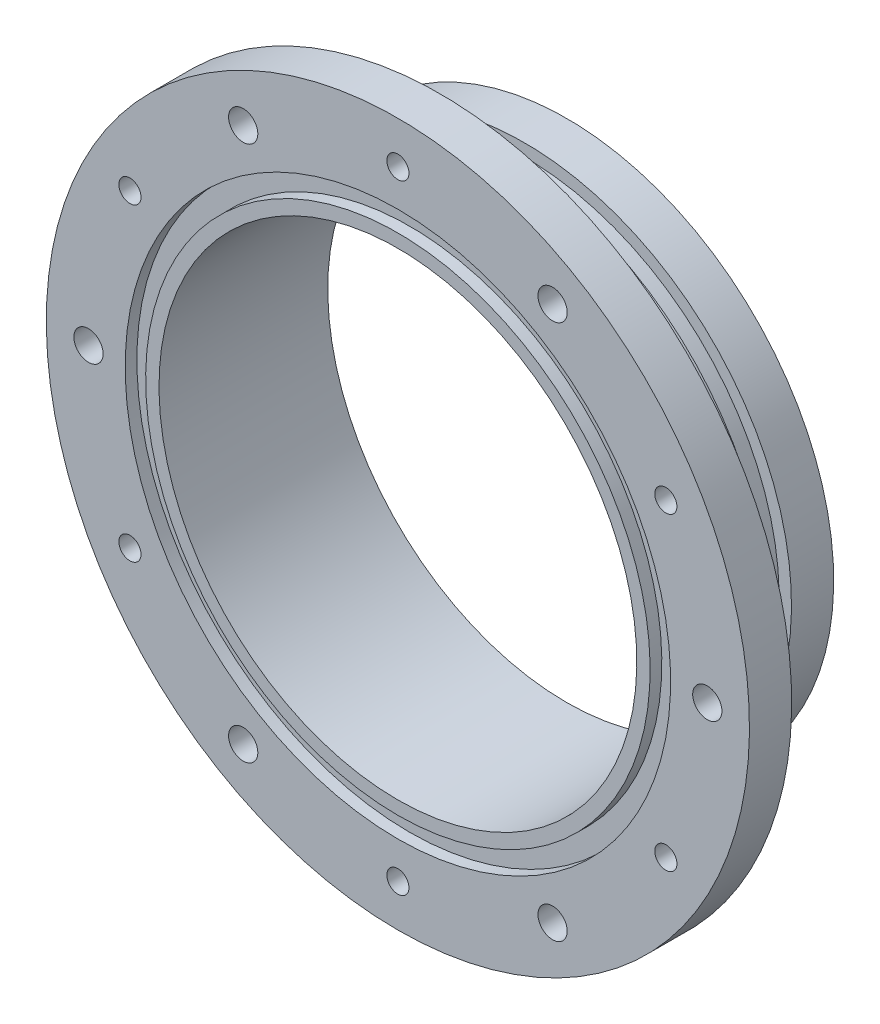
ISO-10303-21;
HEADER;
FILE_DESCRIPTION(('STEP AP214'),'2;1');
FILE_NAME('part.step','',(''),(''),'','','');
FILE_SCHEMA(('AUTOMOTIVE_DESIGN { 1 0 10303 214 1 1 1 1 }'));
ENDSEC;
DATA;
#1=APPLICATION_CONTEXT('core data for automotive mechanical design processes');
#2=APPLICATION_PROTOCOL_DEFINITION('international standard','automotive_design',2000,#1);
#3=PRODUCT_CONTEXT('',#1,'mechanical');
#4=PRODUCT('Part','Part','',(#3));
#5=PRODUCT_RELATED_PRODUCT_CATEGORY('part','',(#4));
#6=PRODUCT_DEFINITION_FORMATION('','',#4);
#7=PRODUCT_DEFINITION_CONTEXT('part definition',#1,'design');
#8=PRODUCT_DEFINITION('design','',#6,#7);
#9=PRODUCT_DEFINITION_SHAPE('','',#8);
#10=(LENGTH_UNIT() NAMED_UNIT(*) SI_UNIT(.MILLI.,.METRE.));
#11=(NAMED_UNIT(*) PLANE_ANGLE_UNIT() SI_UNIT($,.RADIAN.));
#12=(NAMED_UNIT(*) SI_UNIT($,.STERADIAN.) SOLID_ANGLE_UNIT());
#13=UNCERTAINTY_MEASURE_WITH_UNIT(LENGTH_MEASURE(1.E-05),#10,'distance_accuracy_value','');
#14=(GEOMETRIC_REPRESENTATION_CONTEXT(3) GLOBAL_UNCERTAINTY_ASSIGNED_CONTEXT((#13)) GLOBAL_UNIT_ASSIGNED_CONTEXT((#10,
#11,#12)) REPRESENTATION_CONTEXT('',''));
#15=CARTESIAN_POINT('',(0.,0.,0.));
#16=DIRECTION('',(0.,0.,1.));
#17=DIRECTION('',(1.,0.,0.));
#18=AXIS2_PLACEMENT_3D('',#15,#16,#17);
#19=CARTESIAN_POINT('',(0.,0.,0.));
#20=DIRECTION('',(0.,0.,1.));
#21=DIRECTION('',(0.,-1.,0.));
#22=AXIS2_PLACEMENT_3D('',#19,#20,#21);
#23=PLANE('',#22);
#24=CARTESIAN_POINT('',(-34.9250000000017,60.491874454342,0.));
#25=DIRECTION('',(0.,0.,1.));
#26=DIRECTION('',(1.,0.,0.));
#27=AXIS2_PLACEMENT_3D('',#24,#25,#26);
#28=CIRCLE('',#27,3.29999999999998);
#29=CARTESIAN_POINT('',(-31.6250000000017,60.491874454342,0.));
#30=VERTEX_POINT('',#29);
#31=EDGE_CURVE('E122',#30,#30,#28,.T.);
#32=ORIENTED_EDGE('',*,*,#31,.F.);
#33=EDGE_LOOP('',(#32));
#34=FACE_BOUND('',#33,.T.);
#35=CARTESIAN_POINT('',(34.9249999999983,60.491874454344,0.));
#36=DIRECTION('',(0.,0.,1.));
#37=DIRECTION('',(1.,0.,0.));
#38=AXIS2_PLACEMENT_3D('',#35,#36,#37);
#39=CIRCLE('',#38,3.29999999999998);
#40=CARTESIAN_POINT('',(38.2249999999983,60.491874454344,0.));
#41=VERTEX_POINT('',#40);
#42=EDGE_CURVE('E108',#41,#41,#39,.T.);
#43=ORIENTED_EDGE('',*,*,#42,.F.);
#44=EDGE_LOOP('',(#43));
#45=FACE_BOUND('',#44,.T.);
#46=CARTESIAN_POINT('',(69.85,1.99116938679625E-12,0.));
#47=DIRECTION('',(0.,0.,1.));
#48=DIRECTION('',(1.,0.,0.));
#49=AXIS2_PLACEMENT_3D('',#46,#47,#48);
#50=CIRCLE('',#49,3.29999999999998);
#51=CARTESIAN_POINT('',(73.15,1.99116938679625E-12,0.));
#52=VERTEX_POINT('',#51);
#53=EDGE_CURVE('E107',#52,#52,#50,.T.);
#54=ORIENTED_EDGE('',*,*,#53,.F.);
#55=EDGE_LOOP('',(#54));
#56=FACE_BOUND('',#55,.T.);
#57=CARTESIAN_POINT('',(34.9250000000017,-60.491874454342,0.));
#58=DIRECTION('',(0.,0.,1.));
#59=DIRECTION('',(1.,0.,0.));
#60=AXIS2_PLACEMENT_3D('',#57,#58,#59);
#61=CIRCLE('',#60,3.29999999999999);
#62=CARTESIAN_POINT('',(38.2250000000017,-60.491874454342,0.));
#63=VERTEX_POINT('',#62);
#64=EDGE_CURVE('E103',#63,#63,#61,.T.);
#65=ORIENTED_EDGE('',*,*,#64,.F.);
#66=EDGE_LOOP('',(#65));
#67=FACE_BOUND('',#66,.T.);
#68=CARTESIAN_POINT('',(-34.9249999999983,-60.491874454344,0.));
#69=DIRECTION('',(0.,0.,1.));
#70=DIRECTION('',(1.,0.,0.));
#71=AXIS2_PLACEMENT_3D('',#68,#69,#70);
#72=CIRCLE('',#71,3.29999999999998);
#73=CARTESIAN_POINT('',(-31.6249999999983,-60.491874454344,0.));
#74=VERTEX_POINT('',#73);
#75=EDGE_CURVE('E99',#74,#74,#72,.T.);
#76=ORIENTED_EDGE('',*,*,#75,.F.);
#77=EDGE_LOOP('',(#76));
#78=FACE_BOUND('',#77,.T.);
#79=CARTESIAN_POINT('',(-69.85,-1.96785696218278E-12,0.));
#80=DIRECTION('',(0.,0.,1.));
#81=DIRECTION('',(1.,0.,0.));
#82=AXIS2_PLACEMENT_3D('',#79,#80,#81);
#83=CIRCLE('',#82,3.29999999999998);
#84=CARTESIAN_POINT('',(-66.55,-1.96785696218278E-12,0.));
#85=VERTEX_POINT('',#84);
#86=EDGE_CURVE('E94',#85,#85,#83,.T.);
#87=ORIENTED_EDGE('',*,*,#86,.F.);
#88=EDGE_LOOP('',(#87));
#89=FACE_BOUND('',#88,.T.);
#90=CARTESIAN_POINT('',(0.,69.85,0.));
#91=DIRECTION('',(0.,0.,1.));
#92=DIRECTION('',(1.,0.,0.));
#93=AXIS2_PLACEMENT_3D('',#90,#91,#92);
#94=CIRCLE('',#93,2.49999999999999);
#95=CARTESIAN_POINT('',(2.49999999999999,69.85,0.));
#96=VERTEX_POINT('',#95);
#97=EDGE_CURVE('E93',#96,#96,#94,.T.);
#98=ORIENTED_EDGE('',*,*,#97,.F.);
#99=EDGE_LOOP('',(#98));
#100=FACE_BOUND('',#99,.T.);
#101=CARTESIAN_POINT('',(60.4918744543445,34.9250000000026,0.));
#102=DIRECTION('',(0.,0.,1.));
#103=DIRECTION('',(1.,0.,0.));
#104=AXIS2_PLACEMENT_3D('',#101,#102,#103);
#105=CIRCLE('',#104,2.49999999999999);
#106=CARTESIAN_POINT('',(62.9918744543445,34.9250000000026,0.));
#107=VERTEX_POINT('',#106);
#108=EDGE_CURVE('E88',#107,#107,#105,.T.);
#109=ORIENTED_EDGE('',*,*,#108,.F.);
#110=EDGE_LOOP('',(#109));
#111=FACE_BOUND('',#110,.T.);
#112=CARTESIAN_POINT('',(60.4918744543475,-34.9249999999974,0.));
#113=DIRECTION('',(0.,0.,1.));
#114=DIRECTION('',(1.,0.,0.));
#115=AXIS2_PLACEMENT_3D('',#112,#113,#114);
#116=CIRCLE('',#115,2.49999999999999);
#117=CARTESIAN_POINT('',(62.9918744543475,-34.9249999999974,0.));
#118=VERTEX_POINT('',#117);
#119=EDGE_CURVE('E83',#118,#118,#116,.T.);
#120=ORIENTED_EDGE('',*,*,#119,.F.);
#121=EDGE_LOOP('',(#120));
#122=FACE_BOUND('',#121,.T.);
#123=CARTESIAN_POINT('',(5.93010673746503E-12,-69.85,0.));
#124=DIRECTION('',(0.,0.,1.));
#125=DIRECTION('',(1.,0.,0.));
#126=AXIS2_PLACEMENT_3D('',#123,#124,#125);
#127=CIRCLE('',#126,2.49999999999999);
#128=CARTESIAN_POINT('',(2.50000000000592,-69.85,0.));
#129=VERTEX_POINT('',#128);
#130=EDGE_CURVE('E82',#129,#129,#127,.T.);
#131=ORIENTED_EDGE('',*,*,#130,.F.);
#132=EDGE_LOOP('',(#131));
#133=FACE_BOUND('',#132,.T.);
#134=CARTESIAN_POINT('',(-60.4918744543386,-34.9250000000026,0.));
#135=DIRECTION('',(0.,0.,1.));
#136=DIRECTION('',(1.,0.,0.));
#137=AXIS2_PLACEMENT_3D('',#134,#135,#136);
#138=CIRCLE('',#137,2.49999999999999);
#139=CARTESIAN_POINT('',(-57.9918744543386,-34.9250000000026,0.));
#140=VERTEX_POINT('',#139);
#141=EDGE_CURVE('E77',#140,#140,#138,.T.);
#142=ORIENTED_EDGE('',*,*,#141,.F.);
#143=EDGE_LOOP('',(#142));
#144=FACE_BOUND('',#143,.T.);
#145=CARTESIAN_POINT('',(-60.4918744543416,34.9249999999974,0.));
#146=DIRECTION('',(0.,0.,1.));
#147=DIRECTION('',(1.,0.,0.));
#148=AXIS2_PLACEMENT_3D('',#145,#146,#147);
#149=CIRCLE('',#148,2.49999999999999);
#150=CARTESIAN_POINT('',(-57.9918744543416,34.9249999999974,0.));
#151=VERTEX_POINT('',#150);
#152=EDGE_CURVE('E76',#151,#151,#149,.T.);
#153=ORIENTED_EDGE('',*,*,#152,.F.);
#154=EDGE_LOOP('',(#153));
#155=FACE_BOUND('',#154,.T.);
#156=CARTESIAN_POINT('',(0.,0.,0.));
#157=DIRECTION('',(0.,0.,1.));
#158=DIRECTION('',(0.,-1.,0.));
#159=AXIS2_PLACEMENT_3D('',#156,#157,#158);
#160=CIRCLE('',#159,79.375);
#161=CARTESIAN_POINT('',(0.,-79.375,0.));
#162=VERTEX_POINT('',#161);
#163=EDGE_CURVE('E187',#162,#162,#160,.T.);
#164=ORIENTED_EDGE('',*,*,#163,.T.);
#165=EDGE_LOOP('',(#164));
#166=FACE_BOUND('',#165,.T.);
#167=CARTESIAN_POINT('',(0.,0.,0.));
#168=DIRECTION('',(0.,0.,1.));
#169=DIRECTION('',(0.,-1.,0.));
#170=AXIS2_PLACEMENT_3D('',#167,#168,#169);
#171=CIRCLE('',#170,61.5696);
#172=CARTESIAN_POINT('',(0.,-61.5696,0.));
#173=VERTEX_POINT('',#172);
#174=EDGE_CURVE('E167',#173,#173,#171,.T.);
#175=ORIENTED_EDGE('',*,*,#174,.F.);
#176=EDGE_LOOP('',(#175));
#177=FACE_BOUND('',#176,.T.);
#178=ADVANCED_FACE('F53',(#34,#45,#56,#67,#78,#89,#100,#111,#122,#133,#144,#155,#166,#177),#23,.T.);
#179=CARTESIAN_POINT('',(0.,0.,0.));
#180=DIRECTION('',(0.,0.,1.));
#181=DIRECTION('',(0.,-1.,0.));
#182=AXIS2_PLACEMENT_3D('',#179,#180,#181);
#183=CYLINDRICAL_SURFACE('',#182,53.9369);
#184=CARTESIAN_POINT('',(0.,0.,-38.1));
#185=DIRECTION('',(0.,0.,1.));
#186=DIRECTION('',(0.,-1.,0.));
#187=AXIS2_PLACEMENT_3D('',#184,#185,#186);
#188=CIRCLE('',#187,53.9369);
#189=CARTESIAN_POINT('',(0.,-53.9369,-38.1));
#190=VERTEX_POINT('',#189);
#191=EDGE_CURVE('E10',#190,#190,#188,.T.);
#192=ORIENTED_EDGE('',*,*,#191,.F.);
#193=EDGE_LOOP('',(#192));
#194=FACE_BOUND('',#193,.T.);
#195=CARTESIAN_POINT('',(0.,0.,0.));
#196=DIRECTION('',(0.,0.,1.));
#197=DIRECTION('',(0.,-1.,0.));
#198=AXIS2_PLACEMENT_3D('',#195,#196,#197);
#199=CIRCLE('',#198,53.9369);
#200=CARTESIAN_POINT('',(0.,-53.9369,0.));
#201=VERTEX_POINT('',#200);
#202=EDGE_CURVE('E183',#201,#201,#199,.T.);
#203=ORIENTED_EDGE('',*,*,#202,.T.);
#204=EDGE_LOOP('',(#203));
#205=FACE_BOUND('',#204,.T.);
#206=ADVANCED_FACE('F244',(#194,#205),#183,.F.);
#207=CARTESIAN_POINT('',(0.,0.,-38.1));
#208=DIRECTION('',(0.,0.,-1.));
#209=DIRECTION('',(0.,1.,0.));
#210=AXIS2_PLACEMENT_3D('',#207,#208,#209);
#211=PLANE('',#210);
#212=ORIENTED_EDGE('',*,*,#191,.T.);
#213=EDGE_LOOP('',(#212));
#214=FACE_BOUND('',#213,.T.);
#215=CARTESIAN_POINT('',(0.,0.,-38.1));
#216=DIRECTION('',(0.,0.,1.));
#217=DIRECTION('',(0.,-1.,0.));
#218=AXIS2_PLACEMENT_3D('',#215,#216,#217);
#219=CIRCLE('',#218,60.2869);
#220=CARTESIAN_POINT('',(0.,-60.2869,-38.1));
#221=VERTEX_POINT('',#220);
#222=EDGE_CURVE('E62',#221,#221,#219,.T.);
#223=ORIENTED_EDGE('',*,*,#222,.F.);
#224=EDGE_LOOP('',(#223));
#225=FACE_BOUND('',#224,.T.);
#226=ADVANCED_FACE('F235',(#214,#225),#211,.T.);
#227=CARTESIAN_POINT('',(0.,0.,0.));
#228=DIRECTION('',(0.,0.,1.));
#229=DIRECTION('',(0.,-1.,0.));
#230=AXIS2_PLACEMENT_3D('',#227,#228,#229);
#231=CYLINDRICAL_SURFACE('',#230,60.2869);
#232=ORIENTED_EDGE('',*,*,#222,.T.);
#233=EDGE_LOOP('',(#232));
#234=FACE_BOUND('',#233,.T.);
#235=CARTESIAN_POINT('',(0.,0.,-28.575));
#236=DIRECTION('',(0.,0.,1.));
#237=DIRECTION('',(0.,-1.,0.));
#238=AXIS2_PLACEMENT_3D('',#235,#236,#237);
#239=CIRCLE('',#238,60.2869);
#240=CARTESIAN_POINT('',(0.,-60.2869,-28.575));
#241=VERTEX_POINT('',#240);
#242=EDGE_CURVE('E68',#241,#241,#239,.T.);
#243=ORIENTED_EDGE('',*,*,#242,.F.);
#244=EDGE_LOOP('',(#243));
#245=FACE_BOUND('',#244,.T.);
#246=ADVANCED_FACE('F233',(#234,#245),#231,.T.);
#247=CARTESIAN_POINT('',(0.,0.,-28.575));
#248=DIRECTION('',(0.,0.,1.));
#249=DIRECTION('',(0.,-1.,0.));
#250=AXIS2_PLACEMENT_3D('',#247,#248,#249);
#251=PLANE('',#250);
#252=ORIENTED_EDGE('',*,*,#242,.T.);
#253=EDGE_LOOP('',(#252));
#254=FACE_BOUND('',#253,.T.);
#255=CARTESIAN_POINT('',(0.,0.,-28.575));
#256=DIRECTION('',(0.,0.,1.));
#257=DIRECTION('',(0.,-1.,0.));
#258=AXIS2_PLACEMENT_3D('',#255,#256,#257);
#259=CIRCLE('',#258,57.5056);
#260=CARTESIAN_POINT('',(0.,-57.5056,-28.575));
#261=VERTEX_POINT('',#260);
#262=EDGE_CURVE('E223',#261,#261,#259,.T.);
#263=ORIENTED_EDGE('',*,*,#262,.F.);
#264=EDGE_LOOP('',(#263));
#265=FACE_BOUND('',#264,.T.);
#266=ADVANCED_FACE('F230',(#254,#265),#251,.T.);
#267=CARTESIAN_POINT('',(0.,0.,0.));
#268=DIRECTION('',(0.,0.,1.));
#269=DIRECTION('',(0.,-1.,0.));
#270=AXIS2_PLACEMENT_3D('',#267,#268,#269);
#271=CYLINDRICAL_SURFACE('',#270,57.5056);
#272=ORIENTED_EDGE('',*,*,#262,.T.);
#273=EDGE_LOOP('',(#272));
#274=FACE_BOUND('',#273,.T.);
#275=CARTESIAN_POINT('',(0.,0.,-23.495));
#276=DIRECTION('',(0.,0.,1.));
#277=DIRECTION('',(0.,-1.,0.));
#278=AXIS2_PLACEMENT_3D('',#275,#276,#277);
#279=CIRCLE('',#278,57.5056);
#280=CARTESIAN_POINT('',(0.,-57.5056,-23.495));
#281=VERTEX_POINT('',#280);
#282=EDGE_CURVE('E219',#281,#281,#279,.T.);
#283=ORIENTED_EDGE('',*,*,#282,.F.);
#284=EDGE_LOOP('',(#283));
#285=FACE_BOUND('',#284,.T.);
#286=ADVANCED_FACE('F242',(#274,#285),#271,.T.);
#287=CARTESIAN_POINT('',(0.,0.,-23.495));
#288=DIRECTION('',(0.,0.,-1.));
#289=DIRECTION('',(0.,1.,0.));
#290=AXIS2_PLACEMENT_3D('',#287,#288,#289);
#291=PLANE('',#290);
#292=ORIENTED_EDGE('',*,*,#282,.T.);
#293=EDGE_LOOP('',(#292));
#294=FACE_BOUND('',#293,.T.);
#295=CARTESIAN_POINT('',(0.,0.,-23.495));
#296=DIRECTION('',(0.,0.,1.));
#297=DIRECTION('',(0.,-1.,0.));
#298=AXIS2_PLACEMENT_3D('',#295,#296,#297);
#299=CIRCLE('',#298,60.2869);
#300=CARTESIAN_POINT('',(0.,-60.2869,-23.495));
#301=VERTEX_POINT('',#300);
#302=EDGE_CURVE('E215',#301,#301,#299,.T.);
#303=ORIENTED_EDGE('',*,*,#302,.F.);
#304=EDGE_LOOP('',(#303));
#305=FACE_BOUND('',#304,.T.);
#306=ADVANCED_FACE('F310',(#294,#305),#291,.T.);
#307=CARTESIAN_POINT('',(0.,0.,0.));
#308=DIRECTION('',(0.,0.,1.));
#309=DIRECTION('',(0.,-1.,0.));
#310=AXIS2_PLACEMENT_3D('',#307,#308,#309);
#311=CYLINDRICAL_SURFACE('',#310,60.2869);
#312=ORIENTED_EDGE('',*,*,#302,.T.);
#313=EDGE_LOOP('',(#312));
#314=FACE_BOUND('',#313,.T.);
#315=CARTESIAN_POINT('',(0.,0.,-19.05));
#316=DIRECTION('',(0.,0.,1.));
#317=DIRECTION('',(0.,-1.,0.));
#318=AXIS2_PLACEMENT_3D('',#315,#316,#317);
#319=CIRCLE('',#318,60.2869);
#320=CARTESIAN_POINT('',(0.,-60.2869,-19.05));
#321=VERTEX_POINT('',#320);
#322=EDGE_CURVE('E211',#321,#321,#319,.T.);
#323=ORIENTED_EDGE('',*,*,#322,.F.);
#324=EDGE_LOOP('',(#323));
#325=FACE_BOUND('',#324,.T.);
#326=ADVANCED_FACE('F306',(#314,#325),#311,.T.);
#327=CARTESIAN_POINT('',(0.,0.,-19.05));
#328=DIRECTION('',(0.,0.,1.));
#329=DIRECTION('',(0.,-1.,0.));
#330=AXIS2_PLACEMENT_3D('',#327,#328,#329);
#331=PLANE('',#330);
#332=ORIENTED_EDGE('',*,*,#322,.T.);
#333=EDGE_LOOP('',(#332));
#334=FACE_BOUND('',#333,.T.);
#335=CARTESIAN_POINT('',(0.,0.,-19.05));
#336=DIRECTION('',(0.,0.,1.));
#337=DIRECTION('',(0.,-1.,0.));
#338=AXIS2_PLACEMENT_3D('',#335,#336,#337);
#339=CIRCLE('',#338,57.5056);
#340=CARTESIAN_POINT('',(0.,-57.5056,-19.05));
#341=VERTEX_POINT('',#340);
#342=EDGE_CURVE('E207',#341,#341,#339,.T.);
#343=ORIENTED_EDGE('',*,*,#342,.F.);
#344=EDGE_LOOP('',(#343));
#345=FACE_BOUND('',#344,.T.);
#346=ADVANCED_FACE('F302',(#334,#345),#331,.T.);
#347=CARTESIAN_POINT('',(0.,0.,0.));
#348=DIRECTION('',(0.,0.,1.));
#349=DIRECTION('',(0.,-1.,0.));
#350=AXIS2_PLACEMENT_3D('',#347,#348,#349);
#351=CYLINDRICAL_SURFACE('',#350,57.5056);
#352=ORIENTED_EDGE('',*,*,#342,.T.);
#353=EDGE_LOOP('',(#352));
#354=FACE_BOUND('',#353,.T.);
#355=CARTESIAN_POINT('',(0.,0.,-13.97));
#356=DIRECTION('',(0.,0.,1.));
#357=DIRECTION('',(0.,-1.,0.));
#358=AXIS2_PLACEMENT_3D('',#355,#356,#357);
#359=CIRCLE('',#358,57.5056);
#360=CARTESIAN_POINT('',(0.,-57.5056,-13.97));
#361=VERTEX_POINT('',#360);
#362=EDGE_CURVE('E203',#361,#361,#359,.T.);
#363=ORIENTED_EDGE('',*,*,#362,.F.);
#364=EDGE_LOOP('',(#363));
#365=FACE_BOUND('',#364,.T.);
#366=ADVANCED_FACE('F298',(#354,#365),#351,.T.);
#367=CARTESIAN_POINT('',(0.,0.,-13.97));
#368=DIRECTION('',(0.,0.,-1.));
#369=DIRECTION('',(0.,1.,0.));
#370=AXIS2_PLACEMENT_3D('',#367,#368,#369);
#371=PLANE('',#370);
#372=ORIENTED_EDGE('',*,*,#362,.T.);
#373=EDGE_LOOP('',(#372));
#374=FACE_BOUND('',#373,.T.);
#375=CARTESIAN_POINT('',(0.,0.,-13.97));
#376=DIRECTION('',(0.,0.,1.));
#377=DIRECTION('',(0.,-1.,0.));
#378=AXIS2_PLACEMENT_3D('',#375,#376,#377);
#379=CIRCLE('',#378,60.2869);
#380=CARTESIAN_POINT('',(0.,-60.2869,-13.97));
#381=VERTEX_POINT('',#380);
#382=EDGE_CURVE('E199',#381,#381,#379,.T.);
#383=ORIENTED_EDGE('',*,*,#382,.F.);
#384=EDGE_LOOP('',(#383));
#385=FACE_BOUND('',#384,.T.);
#386=ADVANCED_FACE('F294',(#374,#385),#371,.T.);
#387=CARTESIAN_POINT('',(0.,0.,0.));
#388=DIRECTION('',(0.,0.,1.));
#389=DIRECTION('',(0.,-1.,0.));
#390=AXIS2_PLACEMENT_3D('',#387,#388,#389);
#391=CYLINDRICAL_SURFACE('',#390,60.2869);
#392=ORIENTED_EDGE('',*,*,#382,.T.);
#393=EDGE_LOOP('',(#392));
#394=FACE_BOUND('',#393,.T.);
#395=CARTESIAN_POINT('',(0.,0.,-9.525));
#396=DIRECTION('',(0.,0.,1.));
#397=DIRECTION('',(0.,-1.,0.));
#398=AXIS2_PLACEMENT_3D('',#395,#396,#397);
#399=CIRCLE('',#398,60.2869);
#400=CARTESIAN_POINT('',(0.,-60.2869,-9.525));
#401=VERTEX_POINT('',#400);
#402=EDGE_CURVE('E195',#401,#401,#399,.T.);
#403=ORIENTED_EDGE('',*,*,#402,.F.);
#404=EDGE_LOOP('',(#403));
#405=FACE_BOUND('',#404,.T.);
#406=ADVANCED_FACE('F290',(#394,#405),#391,.T.);
#407=CARTESIAN_POINT('',(0.,0.,-9.525));
#408=DIRECTION('',(0.,0.,-1.));
#409=DIRECTION('',(0.,1.,0.));
#410=AXIS2_PLACEMENT_3D('',#407,#408,#409);
#411=PLANE('',#410);
#412=CARTESIAN_POINT('',(-34.9250000000017,60.491874454342,-9.525));
#413=DIRECTION('',(0.,0.,-1.));
#414=DIRECTION('',(0.,1.,0.));
#415=AXIS2_PLACEMENT_3D('',#412,#413,#414);
#416=CIRCLE('',#415,3.29999999999998);
#417=CARTESIAN_POINT('',(-34.9250000000017,63.791874454342,-9.525));
#418=VERTEX_POINT('',#417);
#419=EDGE_CURVE('E57',#418,#418,#416,.T.);
#420=ORIENTED_EDGE('',*,*,#419,.F.);
#421=EDGE_LOOP('',(#420));
#422=FACE_BOUND('',#421,.T.);
#423=CARTESIAN_POINT('',(34.9249999999983,60.491874454344,-9.525));
#424=DIRECTION('',(0.,0.,-1.));
#425=DIRECTION('',(0.,1.,0.));
#426=AXIS2_PLACEMENT_3D('',#423,#424,#425);
#427=CIRCLE('',#426,3.29999999999998);
#428=CARTESIAN_POINT('',(34.9249999999983,63.791874454344,-9.525));
#429=VERTEX_POINT('',#428);
#430=EDGE_CURVE('E104',#429,#429,#427,.T.);
#431=ORIENTED_EDGE('',*,*,#430,.F.);
#432=EDGE_LOOP('',(#431));
#433=FACE_BOUND('',#432,.T.);
#434=CARTESIAN_POINT('',(69.85,1.99116938679625E-12,-9.525));
#435=DIRECTION('',(0.,0.,-1.));
#436=DIRECTION('',(0.,1.,0.));
#437=AXIS2_PLACEMENT_3D('',#434,#435,#436);
#438=CIRCLE('',#437,3.29999999999998);
#439=CARTESIAN_POINT('',(69.85,3.30000000000197,-9.525));
#440=VERTEX_POINT('',#439);
#441=EDGE_CURVE('E114',#440,#440,#438,.T.);
#442=ORIENTED_EDGE('',*,*,#441,.F.);
#443=EDGE_LOOP('',(#442));
#444=FACE_BOUND('',#443,.T.);
#445=CARTESIAN_POINT('',(34.9250000000017,-60.491874454342,-9.525));
#446=DIRECTION('',(0.,0.,-1.));
#447=DIRECTION('',(0.,1.,0.));
#448=AXIS2_PLACEMENT_3D('',#445,#446,#447);
#449=CIRCLE('',#448,3.29999999999999);
#450=CARTESIAN_POINT('',(34.9250000000017,-57.1918744543421,-9.525));
#451=VERTEX_POINT('',#450);
#452=EDGE_CURVE('E100',#451,#451,#449,.T.);
#453=ORIENTED_EDGE('',*,*,#452,.F.);
#454=EDGE_LOOP('',(#453));
#455=FACE_BOUND('',#454,.T.);
#456=CARTESIAN_POINT('',(-34.9249999999983,-60.491874454344,-9.525));
#457=DIRECTION('',(0.,0.,-1.));
#458=DIRECTION('',(0.,1.,0.));
#459=AXIS2_PLACEMENT_3D('',#456,#457,#458);
#460=CIRCLE('',#459,3.29999999999998);
#461=CARTESIAN_POINT('',(-34.9249999999983,-57.1918744543441,-9.525));
#462=VERTEX_POINT('',#461);
#463=EDGE_CURVE('E95',#462,#462,#460,.T.);
#464=ORIENTED_EDGE('',*,*,#463,.F.);
#465=EDGE_LOOP('',(#464));
#466=FACE_BOUND('',#465,.T.);
#467=CARTESIAN_POINT('',(-69.85,-1.96785696218278E-12,-9.525));
#468=DIRECTION('',(0.,0.,-1.));
#469=DIRECTION('',(0.,1.,0.));
#470=AXIS2_PLACEMENT_3D('',#467,#468,#469);
#471=CIRCLE('',#470,3.29999999999998);
#472=CARTESIAN_POINT('',(-69.85,3.29999999999802,-9.525));
#473=VERTEX_POINT('',#472);
#474=EDGE_CURVE('E89',#473,#473,#471,.T.);
#475=ORIENTED_EDGE('',*,*,#474,.F.);
#476=EDGE_LOOP('',(#475));
#477=FACE_BOUND('',#476,.T.);
#478=CARTESIAN_POINT('',(0.,69.85,-9.525));
#479=DIRECTION('',(0.,0.,-1.));
#480=DIRECTION('',(0.,1.,0.));
#481=AXIS2_PLACEMENT_3D('',#478,#479,#480);
#482=CIRCLE('',#481,2.49999999999999);
#483=CARTESIAN_POINT('',(0.,72.35,-9.525));
#484=VERTEX_POINT('',#483);
#485=EDGE_CURVE('E140',#484,#484,#482,.T.);
#486=ORIENTED_EDGE('',*,*,#485,.F.);
#487=EDGE_LOOP('',(#486));
#488=FACE_BOUND('',#487,.T.);
#489=CARTESIAN_POINT('',(60.4918744543445,34.9250000000026,-9.525));
#490=DIRECTION('',(0.,0.,-1.));
#491=DIRECTION('',(0.,1.,0.));
#492=AXIS2_PLACEMENT_3D('',#489,#490,#491);
#493=CIRCLE('',#492,2.49999999999999);
#494=CARTESIAN_POINT('',(60.4918744543445,37.4250000000026,-9.525));
#495=VERTEX_POINT('',#494);
#496=EDGE_CURVE('E84',#495,#495,#493,.T.);
#497=ORIENTED_EDGE('',*,*,#496,.F.);
#498=EDGE_LOOP('',(#497));
#499=FACE_BOUND('',#498,.T.);
#500=CARTESIAN_POINT('',(60.4918744543475,-34.9249999999974,-9.525));
#501=DIRECTION('',(0.,0.,-1.));
#502=DIRECTION('',(0.,1.,0.));
#503=AXIS2_PLACEMENT_3D('',#500,#501,#502);
#504=CIRCLE('',#503,2.49999999999999);
#505=CARTESIAN_POINT('',(60.4918744543475,-32.4249999999974,-9.525));
#506=VERTEX_POINT('',#505);
#507=EDGE_CURVE('E78',#506,#506,#504,.T.);
#508=ORIENTED_EDGE('',*,*,#507,.F.);
#509=EDGE_LOOP('',(#508));
#510=FACE_BOUND('',#509,.T.);
#511=CARTESIAN_POINT('',(5.93010673746503E-12,-69.85,-9.525));
#512=DIRECTION('',(0.,0.,-1.));
#513=DIRECTION('',(0.,1.,0.));
#514=AXIS2_PLACEMENT_3D('',#511,#512,#513);
#515=CIRCLE('',#514,2.49999999999999);
#516=CARTESIAN_POINT('',(5.93010673746503E-12,-67.35,-9.525));
#517=VERTEX_POINT('',#516);
#518=EDGE_CURVE('E153',#517,#517,#515,.T.);
#519=ORIENTED_EDGE('',*,*,#518,.F.);
#520=EDGE_LOOP('',(#519));
#521=FACE_BOUND('',#520,.T.);
#522=CARTESIAN_POINT('',(-60.4918744543386,-34.9250000000026,-9.525));
#523=DIRECTION('',(0.,0.,-1.));
#524=DIRECTION('',(0.,1.,0.));
#525=AXIS2_PLACEMENT_3D('',#522,#523,#524);
#526=CIRCLE('',#525,2.49999999999999);
#527=CARTESIAN_POINT('',(-60.4918744543386,-32.4250000000026,-9.525));
#528=VERTEX_POINT('',#527);
#529=EDGE_CURVE('E72',#528,#528,#526,.T.);
#530=ORIENTED_EDGE('',*,*,#529,.F.);
#531=EDGE_LOOP('',(#530));
#532=FACE_BOUND('',#531,.T.);
#533=CARTESIAN_POINT('',(-60.4918744543416,34.9249999999974,-9.525));
#534=DIRECTION('',(0.,0.,-1.));
#535=DIRECTION('',(0.,1.,0.));
#536=AXIS2_PLACEMENT_3D('',#533,#534,#535);
#537=CIRCLE('',#536,2.49999999999999);
#538=CARTESIAN_POINT('',(-60.4918744543416,37.4249999999974,-9.525));
#539=VERTEX_POINT('',#538);
#540=EDGE_CURVE('E163',#539,#539,#537,.T.);
#541=ORIENTED_EDGE('',*,*,#540,.F.);
#542=EDGE_LOOP('',(#541));
#543=FACE_BOUND('',#542,.T.);
#544=ORIENTED_EDGE('',*,*,#402,.T.);
#545=EDGE_LOOP('',(#544));
#546=FACE_BOUND('',#545,.T.);
#547=CARTESIAN_POINT('',(0.,0.,-9.525));
#548=DIRECTION('',(0.,0.,1.));
#549=DIRECTION('',(0.,-1.,0.));
#550=AXIS2_PLACEMENT_3D('',#547,#548,#549);
#551=CIRCLE('',#550,79.375);
#552=CARTESIAN_POINT('',(0.,-79.375,-9.525));
#553=VERTEX_POINT('',#552);
#554=EDGE_CURVE('E191',#553,#553,#551,.T.);
#555=ORIENTED_EDGE('',*,*,#554,.F.);
#556=EDGE_LOOP('',(#555));
#557=FACE_BOUND('',#556,.T.);
#558=ADVANCED_FACE('F284',(#422,#433,#444,#455,#466,#477,#488,#499,#510,#521,#532,#543,#546,
#557),#411,.T.);
#559=CARTESIAN_POINT('',(0.,0.,0.));
#560=DIRECTION('',(0.,0.,1.));
#561=DIRECTION('',(0.,-1.,0.));
#562=AXIS2_PLACEMENT_3D('',#559,#560,#561);
#563=CYLINDRICAL_SURFACE('',#562,79.375);
#564=ORIENTED_EDGE('',*,*,#554,.T.);
#565=EDGE_LOOP('',(#564));
#566=FACE_BOUND('',#565,.T.);
#567=ORIENTED_EDGE('',*,*,#163,.F.);
#568=EDGE_LOOP('',(#567));
#569=FACE_BOUND('',#568,.T.);
#570=ADVANCED_FACE('F275',(#566,#569),#563,.T.);
#571=CARTESIAN_POINT('',(0.,0.,0.));
#572=DIRECTION('',(0.,0.,1.));
#573=DIRECTION('',(0.,-1.,0.));
#574=AXIS2_PLACEMENT_3D('',#571,#572,#573);
#575=CYLINDRICAL_SURFACE('',#574,56.9468);
#576=CARTESIAN_POINT('',(0.,0.,-2.6416));
#577=DIRECTION('',(0.,0.,1.));
#578=DIRECTION('',(0.,-1.,0.));
#579=AXIS2_PLACEMENT_3D('',#576,#577,#578);
#580=CIRCLE('',#579,56.9468);
#581=CARTESIAN_POINT('',(0.,-56.9468,-2.6416));
#582=VERTEX_POINT('',#581);
#583=EDGE_CURVE('E175',#582,#582,#580,.T.);
#584=ORIENTED_EDGE('',*,*,#583,.T.);
#585=EDGE_LOOP('',(#584));
#586=FACE_BOUND('',#585,.T.);
#587=CARTESIAN_POINT('',(0.,0.,0.));
#588=DIRECTION('',(0.,0.,1.));
#589=DIRECTION('',(0.,-1.,0.));
#590=AXIS2_PLACEMENT_3D('',#587,#588,#589);
#591=CIRCLE('',#590,56.9468);
#592=CARTESIAN_POINT('',(0.,-56.9468,0.));
#593=VERTEX_POINT('',#592);
#594=EDGE_CURVE('E179',#593,#593,#591,.T.);
#595=ORIENTED_EDGE('',*,*,#594,.F.);
#596=EDGE_LOOP('',(#595));
#597=FACE_BOUND('',#596,.T.);
#598=ADVANCED_FACE('F273',(#586,#597),#575,.T.);
#599=CARTESIAN_POINT('',(0.,0.,-2.6416));
#600=DIRECTION('',(0.,0.,1.));
#601=DIRECTION('',(0.,-1.,0.));
#602=AXIS2_PLACEMENT_3D('',#599,#600,#601);
#603=PLANE('',#602);
#604=CARTESIAN_POINT('',(0.,0.,-2.6416));
#605=DIRECTION('',(0.,0.,1.));
#606=DIRECTION('',(0.,-1.,0.));
#607=AXIS2_PLACEMENT_3D('',#604,#605,#606);
#608=CIRCLE('',#607,61.5696);
#609=CARTESIAN_POINT('',(0.,-61.5696,-2.6416));
#610=VERTEX_POINT('',#609);
#611=EDGE_CURVE('E171',#610,#610,#608,.T.);
#612=ORIENTED_EDGE('',*,*,#611,.T.);
#613=EDGE_LOOP('',(#612));
#614=FACE_BOUND('',#613,.T.);
#615=ORIENTED_EDGE('',*,*,#583,.F.);
#616=EDGE_LOOP('',(#615));
#617=FACE_BOUND('',#616,.T.);
#618=ADVANCED_FACE('F266',(#614,#617),#603,.T.);
#619=CARTESIAN_POINT('',(0.,0.,0.));
#620=DIRECTION('',(0.,0.,1.));
#621=DIRECTION('',(0.,-1.,0.));
#622=AXIS2_PLACEMENT_3D('',#619,#620,#621);
#623=CYLINDRICAL_SURFACE('',#622,61.5696);
#624=ORIENTED_EDGE('',*,*,#174,.T.);
#625=EDGE_LOOP('',(#624));
#626=FACE_BOUND('',#625,.T.);
#627=ORIENTED_EDGE('',*,*,#611,.F.);
#628=EDGE_LOOP('',(#627));
#629=FACE_BOUND('',#628,.T.);
#630=ADVANCED_FACE('F256',(#626,#629),#623,.F.);
#631=ORIENTED_EDGE('',*,*,#202,.F.);
#632=EDGE_LOOP('',(#631));
#633=FACE_BOUND('',#632,.T.);
#634=ORIENTED_EDGE('',*,*,#594,.T.);
#635=EDGE_LOOP('',(#634));
#636=FACE_BOUND('',#635,.T.);
#637=ADVANCED_FACE('F55',(#633,#636),#23,.T.);
#638=CARTESIAN_POINT('',(-60.4918744543416,34.9249999999974,0.));
#639=DIRECTION('',(0.,0.,1.));
#640=DIRECTION('',(1.,0.,0.));
#641=AXIS2_PLACEMENT_3D('',#638,#639,#640);
#642=CYLINDRICAL_SURFACE('',#641,2.49999999999999);
#643=ORIENTED_EDGE('',*,*,#540,.T.);
#644=EDGE_LOOP('',(#643));
#645=FACE_BOUND('',#644,.T.);
#646=ORIENTED_EDGE('',*,*,#152,.T.);
#647=EDGE_LOOP('',(#646));
#648=FACE_BOUND('',#647,.T.);
#649=ADVANCED_FACE('F255',(#645,#648),#642,.F.);
#650=CARTESIAN_POINT('',(-60.4918744543386,-34.9250000000026,0.));
#651=DIRECTION('',(0.,0.,1.));
#652=DIRECTION('',(1.,0.,0.));
#653=AXIS2_PLACEMENT_3D('',#650,#651,#652);
#654=CYLINDRICAL_SURFACE('',#653,2.49999999999999);
#655=ORIENTED_EDGE('',*,*,#529,.T.);
#656=EDGE_LOOP('',(#655));
#657=FACE_BOUND('',#656,.T.);
#658=ORIENTED_EDGE('',*,*,#141,.T.);
#659=EDGE_LOOP('',(#658));
#660=FACE_BOUND('',#659,.T.);
#661=ADVANCED_FACE('F262',(#657,#660),#654,.F.);
#662=CARTESIAN_POINT('',(5.93010673746503E-12,-69.85,0.));
#663=DIRECTION('',(0.,0.,1.));
#664=DIRECTION('',(1.,0.,0.));
#665=AXIS2_PLACEMENT_3D('',#662,#663,#664);
#666=CYLINDRICAL_SURFACE('',#665,2.49999999999999);
#667=ORIENTED_EDGE('',*,*,#518,.T.);
#668=EDGE_LOOP('',(#667));
#669=FACE_BOUND('',#668,.T.);
#670=ORIENTED_EDGE('',*,*,#130,.T.);
#671=EDGE_LOOP('',(#670));
#672=FACE_BOUND('',#671,.T.);
#673=ADVANCED_FACE('F401',(#669,#672),#666,.F.);
#674=CARTESIAN_POINT('',(60.4918744543475,-34.9249999999974,0.));
#675=DIRECTION('',(0.,0.,1.));
#676=DIRECTION('',(1.,0.,0.));
#677=AXIS2_PLACEMENT_3D('',#674,#675,#676);
#678=CYLINDRICAL_SURFACE('',#677,2.49999999999999);
#679=ORIENTED_EDGE('',*,*,#507,.T.);
#680=EDGE_LOOP('',(#679));
#681=FACE_BOUND('',#680,.T.);
#682=ORIENTED_EDGE('',*,*,#119,.T.);
#683=EDGE_LOOP('',(#682));
#684=FACE_BOUND('',#683,.T.);
#685=ADVANCED_FACE('F411',(#681,#684),#678,.F.);
#686=CARTESIAN_POINT('',(60.4918744543445,34.9250000000026,0.));
#687=DIRECTION('',(0.,0.,1.));
#688=DIRECTION('',(1.,0.,0.));
#689=AXIS2_PLACEMENT_3D('',#686,#687,#688);
#690=CYLINDRICAL_SURFACE('',#689,2.49999999999999);
#691=ORIENTED_EDGE('',*,*,#496,.T.);
#692=EDGE_LOOP('',(#691));
#693=FACE_BOUND('',#692,.T.);
#694=ORIENTED_EDGE('',*,*,#108,.T.);
#695=EDGE_LOOP('',(#694));
#696=FACE_BOUND('',#695,.T.);
#697=ADVANCED_FACE('F421',(#693,#696),#690,.F.);
#698=CARTESIAN_POINT('',(0.,69.85,0.));
#699=DIRECTION('',(0.,0.,1.));
#700=DIRECTION('',(1.,0.,0.));
#701=AXIS2_PLACEMENT_3D('',#698,#699,#700);
#702=CYLINDRICAL_SURFACE('',#701,2.49999999999999);
#703=ORIENTED_EDGE('',*,*,#485,.T.);
#704=EDGE_LOOP('',(#703));
#705=FACE_BOUND('',#704,.T.);
#706=ORIENTED_EDGE('',*,*,#97,.T.);
#707=EDGE_LOOP('',(#706));
#708=FACE_BOUND('',#707,.T.);
#709=ADVANCED_FACE('F431',(#705,#708),#702,.F.);
#710=CARTESIAN_POINT('',(-69.85,-1.96785696218278E-12,0.));
#711=DIRECTION('',(0.,0.,1.));
#712=DIRECTION('',(1.,0.,0.));
#713=AXIS2_PLACEMENT_3D('',#710,#711,#712);
#714=CYLINDRICAL_SURFACE('',#713,3.29999999999998);
#715=ORIENTED_EDGE('',*,*,#474,.T.);
#716=EDGE_LOOP('',(#715));
#717=FACE_BOUND('',#716,.T.);
#718=ORIENTED_EDGE('',*,*,#86,.T.);
#719=EDGE_LOOP('',(#718));
#720=FACE_BOUND('',#719,.T.);
#721=ADVANCED_FACE('F440',(#717,#720),#714,.F.);
#722=CARTESIAN_POINT('',(-34.9249999999983,-60.491874454344,0.));
#723=DIRECTION('',(0.,0.,1.));
#724=DIRECTION('',(1.,0.,0.));
#725=AXIS2_PLACEMENT_3D('',#722,#723,#724);
#726=CYLINDRICAL_SURFACE('',#725,3.29999999999998);
#727=ORIENTED_EDGE('',*,*,#463,.T.);
#728=EDGE_LOOP('',(#727));
#729=FACE_BOUND('',#728,.T.);
#730=ORIENTED_EDGE('',*,*,#75,.T.);
#731=EDGE_LOOP('',(#730));
#732=FACE_BOUND('',#731,.T.);
#733=ADVANCED_FACE('F472',(#729,#732),#726,.F.);
#734=CARTESIAN_POINT('',(34.9250000000017,-60.491874454342,0.));
#735=DIRECTION('',(0.,0.,1.));
#736=DIRECTION('',(1.,0.,0.));
#737=AXIS2_PLACEMENT_3D('',#734,#735,#736);
#738=CYLINDRICAL_SURFACE('',#737,3.29999999999999);
#739=ORIENTED_EDGE('',*,*,#452,.T.);
#740=EDGE_LOOP('',(#739));
#741=FACE_BOUND('',#740,.T.);
#742=ORIENTED_EDGE('',*,*,#64,.T.);
#743=EDGE_LOOP('',(#742));
#744=FACE_BOUND('',#743,.T.);
#745=ADVANCED_FACE('F481',(#741,#744),#738,.F.);
#746=CARTESIAN_POINT('',(69.85,1.99116938679625E-12,0.));
#747=DIRECTION('',(0.,0.,1.));
#748=DIRECTION('',(1.,0.,0.));
#749=AXIS2_PLACEMENT_3D('',#746,#747,#748);
#750=CYLINDRICAL_SURFACE('',#749,3.29999999999998);
#751=ORIENTED_EDGE('',*,*,#441,.T.);
#752=EDGE_LOOP('',(#751));
#753=FACE_BOUND('',#752,.T.);
#754=ORIENTED_EDGE('',*,*,#53,.T.);
#755=EDGE_LOOP('',(#754));
#756=FACE_BOUND('',#755,.T.);
#757=ADVANCED_FACE('F490',(#753,#756),#750,.F.);
#758=CARTESIAN_POINT('',(34.9249999999983,60.491874454344,0.));
#759=DIRECTION('',(0.,0.,1.));
#760=DIRECTION('',(1.,0.,0.));
#761=AXIS2_PLACEMENT_3D('',#758,#759,#760);
#762=CYLINDRICAL_SURFACE('',#761,3.29999999999998);
#763=ORIENTED_EDGE('',*,*,#430,.T.);
#764=EDGE_LOOP('',(#763));
#765=FACE_BOUND('',#764,.T.);
#766=ORIENTED_EDGE('',*,*,#42,.T.);
#767=EDGE_LOOP('',(#766));
#768=FACE_BOUND('',#767,.T.);
#769=ADVANCED_FACE('F499',(#765,#768),#762,.F.);
#770=CARTESIAN_POINT('',(-34.9250000000017,60.491874454342,0.));
#771=DIRECTION('',(0.,0.,1.));
#772=DIRECTION('',(1.,0.,0.));
#773=AXIS2_PLACEMENT_3D('',#770,#771,#772);
#774=CYLINDRICAL_SURFACE('',#773,3.29999999999998);
#775=ORIENTED_EDGE('',*,*,#419,.T.);
#776=EDGE_LOOP('',(#775));
#777=FACE_BOUND('',#776,.T.);
#778=ORIENTED_EDGE('',*,*,#31,.T.);
#779=EDGE_LOOP('',(#778));
#780=FACE_BOUND('',#779,.T.);
#781=ADVANCED_FACE('F508',(#777,#780),#774,.F.);
#782=CLOSED_SHELL('',(#178,#206,#226,#246,#266,#286,#306,#326,#346,#366,#386,#406,#558,#570,
#598,#618,#630,#637,#649,#661,#673,#685,#697,#709,#721,#733,#745,#757,#769,#781));
#783=MANIFOLD_SOLID_BREP('B2',#782);
#784=ADVANCED_BREP_SHAPE_REPRESENTATION('',(#18,#783),#14);
#785=SHAPE_DEFINITION_REPRESENTATION(#9,#784);
ENDSEC;
END-ISO-10303-21;
